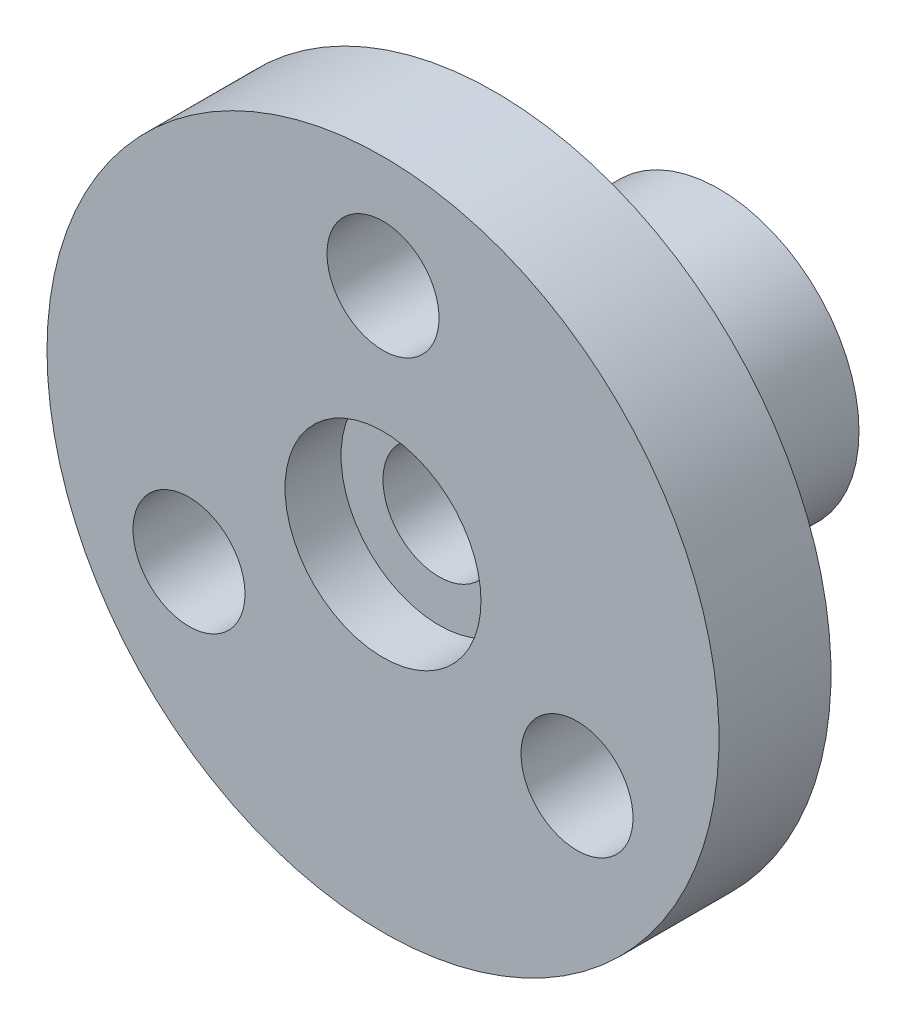
ISO-10303-21;
HEADER;
FILE_DESCRIPTION(('STEP AP214'),'2;1');
FILE_NAME('part.step','',(''),(''),'','','');
FILE_SCHEMA(('AUTOMOTIVE_DESIGN { 1 0 10303 214 1 1 1 1 }'));
ENDSEC;
DATA;
#1=APPLICATION_CONTEXT('core data for automotive mechanical design processes');
#2=APPLICATION_PROTOCOL_DEFINITION('international standard','automotive_design',2000,#1);
#3=PRODUCT_CONTEXT('',#1,'mechanical');
#4=PRODUCT('Part','Part','',(#3));
#5=PRODUCT_RELATED_PRODUCT_CATEGORY('part','',(#4));
#6=PRODUCT_DEFINITION_FORMATION('','',#4);
#7=PRODUCT_DEFINITION_CONTEXT('part definition',#1,'design');
#8=PRODUCT_DEFINITION('design','',#6,#7);
#9=PRODUCT_DEFINITION_SHAPE('','',#8);
#10=(LENGTH_UNIT() NAMED_UNIT(*) SI_UNIT(.MILLI.,.METRE.));
#11=(NAMED_UNIT(*) PLANE_ANGLE_UNIT() SI_UNIT($,.RADIAN.));
#12=(NAMED_UNIT(*) SI_UNIT($,.STERADIAN.) SOLID_ANGLE_UNIT());
#13=UNCERTAINTY_MEASURE_WITH_UNIT(LENGTH_MEASURE(1.E-05),#10,'distance_accuracy_value','');
#14=(GEOMETRIC_REPRESENTATION_CONTEXT(3) GLOBAL_UNCERTAINTY_ASSIGNED_CONTEXT((#13)) GLOBAL_UNIT_ASSIGNED_CONTEXT((#10,
#11,#12)) REPRESENTATION_CONTEXT('',''));
#15=CARTESIAN_POINT('',(0.,0.,0.));
#16=DIRECTION('',(0.,0.,1.));
#17=DIRECTION('',(1.,0.,0.));
#18=AXIS2_PLACEMENT_3D('',#15,#16,#17);
#19=CARTESIAN_POINT('',(0.,0.,0.));
#20=DIRECTION('',(0.,0.,1.));
#21=DIRECTION('',(1.,0.,0.));
#22=AXIS2_PLACEMENT_3D('',#19,#20,#21);
#23=CYLINDRICAL_SURFACE('',#22,1.5875);
#24=CARTESIAN_POINT('',(0.,0.,7.9375));
#25=DIRECTION('',(0.,0.,1.));
#26=DIRECTION('',(1.,0.,0.));
#27=AXIS2_PLACEMENT_3D('',#24,#25,#26);
#28=CIRCLE('',#27,1.5875);
#29=CARTESIAN_POINT('',(1.5875,0.,7.9375));
#30=VERTEX_POINT('',#29);
#31=EDGE_CURVE('E33',#30,#30,#28,.F.);
#32=CARTESIAN_POINT('',(0.,0.,1.58750000000001));
#33=DIRECTION('',(0.,0.,-1.));
#34=DIRECTION('',(-1.,0.,0.));
#35=AXIS2_PLACEMENT_3D('',#32,#33,#34);
#36=CIRCLE('',#35,1.5875);
#37=CARTESIAN_POINT('',(1.5875,0.,1.58750000000001));
#38=VERTEX_POINT('',#37);
#39=EDGE_CURVE('E17',#38,#38,#36,.F.);
#40=CARTESIAN_POINT('',(1.5875,0.,7.9375));
#41=CARTESIAN_POINT('',(1.5875,0.,7.87135416666667));
#42=CARTESIAN_POINT('',(1.5875,0.,7.80520833333333));
#43=CARTESIAN_POINT('',(1.5875,0.,7.67291666666667));
#44=CARTESIAN_POINT('',(1.5875,0.,7.60677083333333));
#45=CARTESIAN_POINT('',(1.5875,0.,7.47447916666667));
#46=CARTESIAN_POINT('',(1.5875,0.,7.40833333333333));
#47=CARTESIAN_POINT('',(1.5875,0.,7.27604166666667));
#48=CARTESIAN_POINT('',(1.5875,0.,7.20989583333333));
#49=CARTESIAN_POINT('',(1.5875,0.,7.07760416666667));
#50=CARTESIAN_POINT('',(1.5875,0.,7.01145833333333));
#51=CARTESIAN_POINT('',(1.5875,0.,6.87916666666667));
#52=CARTESIAN_POINT('',(1.5875,0.,6.81302083333333));
#53=CARTESIAN_POINT('',(1.5875,0.,6.68072916666667));
#54=CARTESIAN_POINT('',(1.5875,0.,6.61458333333333));
#55=CARTESIAN_POINT('',(1.5875,0.,6.48229166666667));
#56=CARTESIAN_POINT('',(1.5875,0.,6.41614583333333));
#57=CARTESIAN_POINT('',(1.5875,0.,6.28385416666667));
#58=CARTESIAN_POINT('',(1.5875,0.,6.21770833333333));
#59=CARTESIAN_POINT('',(1.5875,0.,6.08541666666667));
#60=CARTESIAN_POINT('',(1.5875,0.,6.01927083333333));
#61=CARTESIAN_POINT('',(1.5875,0.,5.88697916666667));
#62=CARTESIAN_POINT('',(1.5875,0.,5.82083333333333));
#63=CARTESIAN_POINT('',(1.5875,0.,5.68854166666667));
#64=CARTESIAN_POINT('',(1.5875,0.,5.62239583333333));
#65=CARTESIAN_POINT('',(1.5875,0.,5.49010416666667));
#66=CARTESIAN_POINT('',(1.5875,0.,5.42395833333333));
#67=CARTESIAN_POINT('',(1.5875,0.,5.29166666666667));
#68=CARTESIAN_POINT('',(1.5875,0.,5.22552083333333));
#69=CARTESIAN_POINT('',(1.5875,0.,5.09322916666667));
#70=CARTESIAN_POINT('',(1.5875,0.,5.02708333333333));
#71=CARTESIAN_POINT('',(1.5875,0.,4.89479166666667));
#72=CARTESIAN_POINT('',(1.5875,0.,4.82864583333333));
#73=CARTESIAN_POINT('',(1.5875,0.,4.69635416666667));
#74=CARTESIAN_POINT('',(1.5875,0.,4.63020833333333));
#75=CARTESIAN_POINT('',(1.5875,0.,4.49791666666667));
#76=CARTESIAN_POINT('',(1.5875,0.,4.43177083333333));
#77=CARTESIAN_POINT('',(1.5875,0.,4.29947916666667));
#78=CARTESIAN_POINT('',(1.5875,0.,4.23333333333334));
#79=CARTESIAN_POINT('',(1.5875,0.,4.10104166666667));
#80=CARTESIAN_POINT('',(1.5875,0.,4.03489583333334));
#81=CARTESIAN_POINT('',(1.5875,0.,3.90260416666667));
#82=CARTESIAN_POINT('',(1.5875,0.,3.83645833333334));
#83=CARTESIAN_POINT('',(1.5875,0.,3.70416666666667));
#84=CARTESIAN_POINT('',(1.5875,0.,3.63802083333334));
#85=CARTESIAN_POINT('',(1.5875,0.,3.50572916666667));
#86=CARTESIAN_POINT('',(1.5875,0.,3.43958333333334));
#87=CARTESIAN_POINT('',(1.5875,0.,3.30729166666667));
#88=CARTESIAN_POINT('',(1.5875,0.,3.24114583333334));
#89=CARTESIAN_POINT('',(1.5875,0.,3.10885416666667));
#90=CARTESIAN_POINT('',(1.5875,0.,3.04270833333334));
#91=CARTESIAN_POINT('',(1.5875,0.,2.91041666666667));
#92=CARTESIAN_POINT('',(1.5875,0.,2.84427083333334));
#93=CARTESIAN_POINT('',(1.5875,0.,2.71197916666667));
#94=CARTESIAN_POINT('',(1.5875,0.,2.64583333333334));
#95=CARTESIAN_POINT('',(1.5875,0.,2.51354166666667));
#96=CARTESIAN_POINT('',(1.5875,0.,2.44739583333334));
#97=CARTESIAN_POINT('',(1.5875,0.,2.31510416666667));
#98=CARTESIAN_POINT('',(1.5875,0.,2.24895833333334));
#99=CARTESIAN_POINT('',(1.5875,0.,2.11666666666667));
#100=CARTESIAN_POINT('',(1.5875,0.,2.05052083333334));
#101=CARTESIAN_POINT('',(1.5875,0.,1.91822916666667));
#102=CARTESIAN_POINT('',(1.5875,0.,1.85208333333334));
#103=CARTESIAN_POINT('',(1.5875,0.,1.71979166666667));
#104=CARTESIAN_POINT('',(1.5875,0.,1.65364583333334));
#105=CARTESIAN_POINT('',(1.5875,0.,1.58750000000001));
#106=B_SPLINE_CURVE_WITH_KNOTS('',3,(#40,#41,#42,#43,#44,#45,#46,#47,#48,#49,#50,#51,#52,#53,
#54,#55,#56,#57,#58,#59,#60,#61,#62,#63,#64,#65,#66,#67,#68,#69,#70,#71,#72,#73,#74,#75,#76,#77,
#78,#79,#80,#81,#82,#83,#84,#85,#86,#87,#88,#89,#90,#91,#92,#93,#94,#95,#96,#97,#98,#99,#100,
#101,#102,#103,#104,#105),.UNSPECIFIED.,.F.,.F.,(4,2,2,2,2,2,2,2,2,2,2,2,2,2,2,2,2,2,2,2,2,2,2,
2,2,2,2,2,2,2,2,2,4),(0.,0.198437499999999,0.396874999999999,0.595312499999999,
0.793749999999998,0.992187499999998,1.190625,1.3890625,1.5875,1.7859375,1.984375,2.1828125,
2.38125,2.5796875,2.778125,2.9765625,3.175,3.3734375,3.571875,3.7703125,3.96875,4.1671875,
4.365625,4.5640625,4.76249999999999,4.96093749999999,5.15937499999999,5.35781249999999,
5.55624999999999,5.75468749999999,5.95312499999999,6.15156249999999,6.34999999999999),.UNSPECIFIED.);
#107=EDGE_CURVE('BSEAM13',#30,#38,#106,.T.);
#108=ORIENTED_EDGE('',*,*,#31,.F.);
#109=ORIENTED_EDGE('',*,*,#39,.F.);
#110=ORIENTED_EDGE('',*,*,#107,.T.);
#111=ORIENTED_EDGE('',*,*,#107,.F.);
#112=EDGE_LOOP('',(#108,#110,#109,#111));
#113=FACE_BOUND('',#112,.T.);
#114=ADVANCED_FACE('F13',(#113),#23,.F.);
#115=CARTESIAN_POINT('',(0.,0.,9.52500000000001));
#116=DIRECTION('',(0.,0.,-1.));
#117=DIRECTION('',(-1.,0.,0.));
#118=AXIS2_PLACEMENT_3D('',#115,#116,#117);
#119=CYLINDRICAL_SURFACE('',#118,9.525);
#120=CARTESIAN_POINT('',(0.,0.,6.35000000000001));
#121=DIRECTION('',(0.,0.,1.));
#122=DIRECTION('',(1.,0.,0.));
#123=AXIS2_PLACEMENT_3D('',#120,#121,#122);
#124=CIRCLE('',#123,9.525);
#125=CARTESIAN_POINT('',(-9.525,0.,6.35000000000001));
#126=VERTEX_POINT('',#125);
#127=EDGE_CURVE('E21',#126,#126,#124,.T.);
#128=CARTESIAN_POINT('',(0.,0.,9.52500000000001));
#129=DIRECTION('',(0.,0.,1.));
#130=DIRECTION('',(1.,0.,0.));
#131=AXIS2_PLACEMENT_3D('',#128,#129,#130);
#132=CIRCLE('',#131,9.525);
#133=CARTESIAN_POINT('',(-9.525,0.,9.52500000000001));
#134=VERTEX_POINT('',#133);
#135=EDGE_CURVE('E9',#134,#134,#132,.T.);
#136=CARTESIAN_POINT('',(-9.525,0.,6.35000000000001));
#137=CARTESIAN_POINT('',(-9.525,0.,6.38307291666668));
#138=CARTESIAN_POINT('',(-9.525,0.,6.41614583333334));
#139=CARTESIAN_POINT('',(-9.525,0.,6.48229166666667));
#140=CARTESIAN_POINT('',(-9.525,0.,6.51536458333334));
#141=CARTESIAN_POINT('',(-9.525,0.,6.58151041666667));
#142=CARTESIAN_POINT('',(-9.525,0.,6.61458333333334));
#143=CARTESIAN_POINT('',(-9.525,0.,6.68072916666667));
#144=CARTESIAN_POINT('',(-9.525,0.,6.71380208333334));
#145=CARTESIAN_POINT('',(-9.525,0.,6.77994791666667));
#146=CARTESIAN_POINT('',(-9.525,0.,6.81302083333334));
#147=CARTESIAN_POINT('',(-9.525,0.,6.87916666666667));
#148=CARTESIAN_POINT('',(-9.525,0.,6.91223958333334));
#149=CARTESIAN_POINT('',(-9.525,0.,6.97838541666667));
#150=CARTESIAN_POINT('',(-9.525,0.,7.01145833333334));
#151=CARTESIAN_POINT('',(-9.525,0.,7.07760416666667));
#152=CARTESIAN_POINT('',(-9.525,0.,7.11067708333334));
#153=CARTESIAN_POINT('',(-9.525,0.,7.17682291666667));
#154=CARTESIAN_POINT('',(-9.525,0.,7.20989583333334));
#155=CARTESIAN_POINT('',(-9.525,0.,7.27604166666667));
#156=CARTESIAN_POINT('',(-9.525,0.,7.30911458333334));
#157=CARTESIAN_POINT('',(-9.525,0.,7.37526041666667));
#158=CARTESIAN_POINT('',(-9.525,0.,7.40833333333334));
#159=CARTESIAN_POINT('',(-9.525,0.,7.47447916666667));
#160=CARTESIAN_POINT('',(-9.525,0.,7.50755208333334));
#161=CARTESIAN_POINT('',(-9.525,0.,7.57369791666667));
#162=CARTESIAN_POINT('',(-9.525,0.,7.60677083333334));
#163=CARTESIAN_POINT('',(-9.525,0.,7.67291666666667));
#164=CARTESIAN_POINT('',(-9.525,0.,7.70598958333334));
#165=CARTESIAN_POINT('',(-9.525,0.,7.77213541666667));
#166=CARTESIAN_POINT('',(-9.525,0.,7.80520833333334));
#167=CARTESIAN_POINT('',(-9.525,0.,7.87135416666667));
#168=CARTESIAN_POINT('',(-9.525,0.,7.90442708333334));
#169=CARTESIAN_POINT('',(-9.525,0.,7.97057291666667));
#170=CARTESIAN_POINT('',(-9.525,0.,8.00364583333334));
#171=CARTESIAN_POINT('',(-9.525,0.,8.06979166666667));
#172=CARTESIAN_POINT('',(-9.525,0.,8.10286458333334));
#173=CARTESIAN_POINT('',(-9.525,0.,8.16901041666667));
#174=CARTESIAN_POINT('',(-9.525,0.,8.20208333333334));
#175=CARTESIAN_POINT('',(-9.525,0.,8.26822916666667));
#176=CARTESIAN_POINT('',(-9.525,0.,8.30130208333334));
#177=CARTESIAN_POINT('',(-9.525,0.,8.36744791666667));
#178=CARTESIAN_POINT('',(-9.525,0.,8.40052083333334));
#179=CARTESIAN_POINT('',(-9.525,0.,8.46666666666667));
#180=CARTESIAN_POINT('',(-9.525,0.,8.49973958333334));
#181=CARTESIAN_POINT('',(-9.525,0.,8.56588541666667));
#182=CARTESIAN_POINT('',(-9.525,0.,8.59895833333334));
#183=CARTESIAN_POINT('',(-9.525,0.,8.66510416666667));
#184=CARTESIAN_POINT('',(-9.525,0.,8.69817708333334));
#185=CARTESIAN_POINT('',(-9.525,0.,8.76432291666667));
#186=CARTESIAN_POINT('',(-9.525,0.,8.79739583333334));
#187=CARTESIAN_POINT('',(-9.525,0.,8.86354166666667));
#188=CARTESIAN_POINT('',(-9.525,0.,8.89661458333334));
#189=CARTESIAN_POINT('',(-9.525,0.,8.96276041666667));
#190=CARTESIAN_POINT('',(-9.525,0.,8.99583333333334));
#191=CARTESIAN_POINT('',(-9.525,0.,9.06197916666667));
#192=CARTESIAN_POINT('',(-9.525,0.,9.09505208333334));
#193=CARTESIAN_POINT('',(-9.525,0.,9.16119791666667));
#194=CARTESIAN_POINT('',(-9.525,0.,9.19427083333334));
#195=CARTESIAN_POINT('',(-9.525,0.,9.26041666666667));
#196=CARTESIAN_POINT('',(-9.525,0.,9.29348958333334));
#197=CARTESIAN_POINT('',(-9.525,0.,9.35963541666667));
#198=CARTESIAN_POINT('',(-9.525,0.,9.39270833333334));
#199=CARTESIAN_POINT('',(-9.525,0.,9.45885416666667));
#200=CARTESIAN_POINT('',(-9.525,0.,9.49192708333334));
#201=CARTESIAN_POINT('',(-9.525,0.,9.52500000000001));
#202=B_SPLINE_CURVE_WITH_KNOTS('',3,(#136,#137,#138,#139,#140,#141,#142,#143,#144,#145,#146,
#147,#148,#149,#150,#151,#152,#153,#154,#155,#156,#157,#158,#159,#160,#161,#162,#163,#164,#165,
#166,#167,#168,#169,#170,#171,#172,#173,#174,#175,#176,#177,#178,#179,#180,#181,#182,#183,#184,
#185,#186,#187,#188,#189,#190,#191,#192,#193,#194,#195,#196,#197,#198,#199,#200,#201),
.UNSPECIFIED.,.F.,.F.,(4,2,2,2,2,2,2,2,2,2,2,2,2,2,2,2,2,2,2,2,2,2,2,2,2,2,2,2,2,2,2,2,4),(0.,
0.0992187499999995,0.198437499999999,0.297656249999999,0.396875,0.496093749999999,
0.595312499999999,0.694531249999999,0.793749999999999,0.892968749999999,0.992187499999998,
1.09140625,1.190625,1.28984375,1.3890625,1.48828125,1.5875,1.68671875,1.7859375,1.88515625,
1.984375,2.08359375,2.1828125,2.28203125,2.38125,2.48046875,2.5796875,2.67890625,2.778125,
2.87734375,2.9765625,3.07578125,3.175),.UNSPECIFIED.);
#203=EDGE_CURVE('BSEAM15',#126,#134,#202,.T.);
#204=ORIENTED_EDGE('',*,*,#127,.T.);
#205=ORIENTED_EDGE('',*,*,#135,.F.);
#206=ORIENTED_EDGE('',*,*,#203,.T.);
#207=ORIENTED_EDGE('',*,*,#203,.F.);
#208=EDGE_LOOP('',(#204,#206,#205,#207));
#209=FACE_BOUND('',#208,.T.);
#210=ADVANCED_FACE('F15',(#209),#119,.T.);
#211=CARTESIAN_POINT('',(0.,0.,9.52500000000001));
#212=DIRECTION('',(0.,0.,1.));
#213=DIRECTION('',(1.,0.,0.));
#214=AXIS2_PLACEMENT_3D('',#211,#212,#213);
#215=PLANE('',#214);
#216=CARTESIAN_POINT('',(-5.49926131403122,-3.17499999999995,9.52500000000001));
#217=DIRECTION('',(0.,0.,-1.));
#218=DIRECTION('',(1.,0.,0.));
#219=AXIS2_PLACEMENT_3D('',#216,#217,#218);
#220=CIRCLE('',#219,1.5875);
#221=CARTESIAN_POINT('',(-3.91176131403122,-3.17499999999995,9.52500000000001));
#222=VERTEX_POINT('',#221);
#223=EDGE_CURVE('E64',#222,#222,#220,.T.);
#224=ORIENTED_EDGE('',*,*,#223,.T.);
#225=EDGE_LOOP('',(#224));
#226=FACE_BOUND('',#225,.T.);
#227=CARTESIAN_POINT('',(5.49926131403121,-3.17499999999995,9.52500000000001));
#228=DIRECTION('',(0.,0.,-1.));
#229=DIRECTION('',(-1.,0.,0.));
#230=AXIS2_PLACEMENT_3D('',#227,#228,#229);
#231=CIRCLE('',#230,1.5875);
#232=CARTESIAN_POINT('',(3.91176131403122,-3.17499999999995,9.52500000000001));
#233=VERTEX_POINT('',#232);
#234=EDGE_CURVE('E58',#233,#233,#231,.T.);
#235=ORIENTED_EDGE('',*,*,#234,.T.);
#236=EDGE_LOOP('',(#235));
#237=FACE_BOUND('',#236,.T.);
#238=CARTESIAN_POINT('',(0.,6.35,9.52500000000001));
#239=DIRECTION('',(0.,0.,-1.));
#240=DIRECTION('',(-1.,0.,0.));
#241=AXIS2_PLACEMENT_3D('',#238,#239,#240);
#242=CIRCLE('',#241,1.5875);
#243=CARTESIAN_POINT('',(-1.5875,6.35,9.52500000000001));
#244=VERTEX_POINT('',#243);
#245=EDGE_CURVE('E52',#244,#244,#242,.T.);
#246=ORIENTED_EDGE('',*,*,#245,.T.);
#247=EDGE_LOOP('',(#246));
#248=FACE_BOUND('',#247,.T.);
#249=CARTESIAN_POINT('',(0.,0.,9.52500000000001));
#250=DIRECTION('',(0.,0.,1.));
#251=DIRECTION('',(1.,0.,0.));
#252=AXIS2_PLACEMENT_3D('',#249,#250,#251);
#253=CIRCLE('',#252,2.77749);
#254=CARTESIAN_POINT('',(2.77749,0.,9.52500000000001));
#255=VERTEX_POINT('',#254);
#256=EDGE_CURVE('E40',#255,#255,#253,.T.);
#257=ORIENTED_EDGE('',*,*,#256,.F.);
#258=EDGE_LOOP('',(#257));
#259=FACE_BOUND('',#258,.T.);
#260=ORIENTED_EDGE('',*,*,#135,.T.);
#261=EDGE_LOOP('',(#260));
#262=FACE_BOUND('',#261,.T.);
#263=ADVANCED_FACE('F77',(#226,#237,#248,#259,#262),#215,.T.);
#264=CARTESIAN_POINT('',(0.,0.,6.34999999999999));
#265=DIRECTION('',(0.,0.,1.));
#266=DIRECTION('',(1.,0.,0.));
#267=AXIS2_PLACEMENT_3D('',#264,#265,#266);
#268=PLANE('',#267);
#269=CARTESIAN_POINT('',(-5.49926131403122,-3.17499999999995,6.34999999999999));
#270=DIRECTION('',(0.,0.,-1.));
#271=DIRECTION('',(1.,0.,0.));
#272=AXIS2_PLACEMENT_3D('',#269,#270,#271);
#273=CIRCLE('',#272,1.5875);
#274=CARTESIAN_POINT('',(-3.91176131403122,-3.17499999999995,6.34999999999999));
#275=VERTEX_POINT('',#274);
#276=EDGE_CURVE('E67',#275,#275,#273,.T.);
#277=ORIENTED_EDGE('',*,*,#276,.F.);
#278=EDGE_LOOP('',(#277));
#279=FACE_BOUND('',#278,.T.);
#280=CARTESIAN_POINT('',(5.49926131403121,-3.17499999999995,6.34999999999999));
#281=DIRECTION('',(0.,0.,-1.));
#282=DIRECTION('',(-1.,0.,0.));
#283=AXIS2_PLACEMENT_3D('',#280,#281,#282);
#284=CIRCLE('',#283,1.5875);
#285=CARTESIAN_POINT('',(3.91176131403122,-3.17499999999995,6.34999999999999));
#286=VERTEX_POINT('',#285);
#287=EDGE_CURVE('E61',#286,#286,#284,.T.);
#288=ORIENTED_EDGE('',*,*,#287,.F.);
#289=EDGE_LOOP('',(#288));
#290=FACE_BOUND('',#289,.T.);
#291=CARTESIAN_POINT('',(0.,6.35,6.34999999999999));
#292=DIRECTION('',(0.,0.,-1.));
#293=DIRECTION('',(-1.,0.,0.));
#294=AXIS2_PLACEMENT_3D('',#291,#292,#293);
#295=CIRCLE('',#294,1.5875);
#296=CARTESIAN_POINT('',(-1.5875,6.35,6.34999999999999));
#297=VERTEX_POINT('',#296);
#298=EDGE_CURVE('E55',#297,#297,#295,.T.);
#299=ORIENTED_EDGE('',*,*,#298,.F.);
#300=EDGE_LOOP('',(#299));
#301=FACE_BOUND('',#300,.T.);
#302=CARTESIAN_POINT('',(0.,0.,6.34999999999999));
#303=DIRECTION('',(0.,0.,1.));
#304=DIRECTION('',(1.,0.,0.));
#305=AXIS2_PLACEMENT_3D('',#302,#303,#304);
#306=CIRCLE('',#305,3.96875);
#307=CARTESIAN_POINT('',(3.96875,0.,6.34999999999999));
#308=VERTEX_POINT('',#307);
#309=EDGE_CURVE('E30',#308,#308,#306,.T.);
#310=ORIENTED_EDGE('',*,*,#309,.T.);
#311=EDGE_LOOP('',(#310));
#312=FACE_BOUND('',#311,.T.);
#313=ORIENTED_EDGE('',*,*,#127,.F.);
#314=EDGE_LOOP('',(#313));
#315=FACE_BOUND('',#314,.T.);
#316=ADVANCED_FACE('F73',(#279,#290,#301,#312,#315),#268,.F.);
#317=CARTESIAN_POINT('',(0.,0.,-31.75));
#318=DIRECTION('',(0.,0.,1.));
#319=DIRECTION('',(1.,0.,0.));
#320=AXIS2_PLACEMENT_3D('',#317,#318,#319);
#321=CYLINDRICAL_SURFACE('',#320,3.96875);
#322=CARTESIAN_POINT('',(0.,0.,0.));
#323=DIRECTION('',(0.,0.,1.));
#324=DIRECTION('',(1.,0.,0.));
#325=AXIS2_PLACEMENT_3D('',#322,#323,#324);
#326=CIRCLE('',#325,3.96875);
#327=CARTESIAN_POINT('',(3.96875,0.,0.));
#328=VERTEX_POINT('',#327);
#329=EDGE_CURVE('E26',#328,#328,#326,.T.);
#330=CARTESIAN_POINT('',(3.96875,0.,6.34999999999999));
#331=CARTESIAN_POINT('',(3.96875,0.,6.28385416666665));
#332=CARTESIAN_POINT('',(3.96875,0.,6.21770833333332));
#333=CARTESIAN_POINT('',(3.96875,0.,6.08541666666665));
#334=CARTESIAN_POINT('',(3.96875,0.,6.01927083333332));
#335=CARTESIAN_POINT('',(3.96875,0.,5.88697916666666));
#336=CARTESIAN_POINT('',(3.96875,0.,5.82083333333332));
#337=CARTESIAN_POINT('',(3.96875,0.,5.68854166666666));
#338=CARTESIAN_POINT('',(3.96875,0.,5.62239583333332));
#339=CARTESIAN_POINT('',(3.96875,0.,5.49010416666666));
#340=CARTESIAN_POINT('',(3.96875,0.,5.42395833333332));
#341=CARTESIAN_POINT('',(3.96875,0.,5.29166666666666));
#342=CARTESIAN_POINT('',(3.96875,0.,5.22552083333332));
#343=CARTESIAN_POINT('',(3.96875,0.,5.09322916666665));
#344=CARTESIAN_POINT('',(3.96875,0.,5.02708333333332));
#345=CARTESIAN_POINT('',(3.96875,0.,4.89479166666666));
#346=CARTESIAN_POINT('',(3.96875,0.,4.82864583333332));
#347=CARTESIAN_POINT('',(3.96875,0.,4.69635416666666));
#348=CARTESIAN_POINT('',(3.96875,0.,4.63020833333332));
#349=CARTESIAN_POINT('',(3.96875,0.,4.49791666666665));
#350=CARTESIAN_POINT('',(3.96875,0.,4.43177083333332));
#351=CARTESIAN_POINT('',(3.96875,0.,4.29947916666666));
#352=CARTESIAN_POINT('',(3.96875,0.,4.23333333333332));
#353=CARTESIAN_POINT('',(3.96875,0.,4.10104166666665));
#354=CARTESIAN_POINT('',(3.96875,0.,4.03489583333332));
#355=CARTESIAN_POINT('',(3.96875,0.,3.90260416666665));
#356=CARTESIAN_POINT('',(3.96875,0.,3.83645833333332));
#357=CARTESIAN_POINT('',(3.96875,0.,3.70416666666666));
#358=CARTESIAN_POINT('',(3.96875,0.,3.63802083333332));
#359=CARTESIAN_POINT('',(3.96875,0.,3.50572916666666));
#360=CARTESIAN_POINT('',(3.96875,0.,3.43958333333332));
#361=CARTESIAN_POINT('',(3.96875,0.,3.30729166666666));
#362=CARTESIAN_POINT('',(3.96875,0.,3.24114583333332));
#363=CARTESIAN_POINT('',(3.96875,0.,3.10885416666666));
#364=CARTESIAN_POINT('',(3.96875,0.,3.04270833333332));
#365=CARTESIAN_POINT('',(3.96875,0.,2.91041666666666));
#366=CARTESIAN_POINT('',(3.96875,0.,2.84427083333332));
#367=CARTESIAN_POINT('',(3.96875,0.,2.71197916666666));
#368=CARTESIAN_POINT('',(3.96875,0.,2.64583333333332));
#369=CARTESIAN_POINT('',(3.96875,0.,2.51354166666666));
#370=CARTESIAN_POINT('',(3.96875,0.,2.44739583333333));
#371=CARTESIAN_POINT('',(3.96875,0.,2.31510416666666));
#372=CARTESIAN_POINT('',(3.96875,0.,2.24895833333333));
#373=CARTESIAN_POINT('',(3.96875,0.,2.11666666666666));
#374=CARTESIAN_POINT('',(3.96875,0.,2.05052083333332));
#375=CARTESIAN_POINT('',(3.96875,0.,1.91822916666666));
#376=CARTESIAN_POINT('',(3.96875,0.,1.85208333333333));
#377=CARTESIAN_POINT('',(3.96875,0.,1.71979166666666));
#378=CARTESIAN_POINT('',(3.96875,0.,1.65364583333333));
#379=CARTESIAN_POINT('',(3.96875,0.,1.52135416666666));
#380=CARTESIAN_POINT('',(3.96875,0.,1.45520833333332));
#381=CARTESIAN_POINT('',(3.96875,0.,1.32291666666666));
#382=CARTESIAN_POINT('',(3.96875,0.,1.25677083333333));
#383=CARTESIAN_POINT('',(3.96875,0.,1.12447916666666));
#384=CARTESIAN_POINT('',(3.96875,0.,1.05833333333333));
#385=CARTESIAN_POINT('',(3.96875,0.,0.926041666666657));
#386=CARTESIAN_POINT('',(3.96875,0.,0.859895833333323));
#387=CARTESIAN_POINT('',(3.96875,0.,0.727604166666657));
#388=CARTESIAN_POINT('',(3.96875,0.,0.661458333333325));
#389=CARTESIAN_POINT('',(3.96875,0.,0.529166666666659));
#390=CARTESIAN_POINT('',(3.96875,0.,0.463020833333325));
#391=CARTESIAN_POINT('',(3.96875,0.,0.330729166666659));
#392=CARTESIAN_POINT('',(3.96875,0.,0.264583333333327));
#393=CARTESIAN_POINT('',(3.96875,0.,0.132291666666661));
#394=CARTESIAN_POINT('',(3.96875,0.,0.0661458333333273));
#395=CARTESIAN_POINT('',(3.96875,0.,0.));
#396=B_SPLINE_CURVE_WITH_KNOTS('',3,(#330,#331,#332,#333,#334,#335,#336,#337,#338,#339,#340,
#341,#342,#343,#344,#345,#346,#347,#348,#349,#350,#351,#352,#353,#354,#355,#356,#357,#358,#359,
#360,#361,#362,#363,#364,#365,#366,#367,#368,#369,#370,#371,#372,#373,#374,#375,#376,#377,#378,
#379,#380,#381,#382,#383,#384,#385,#386,#387,#388,#389,#390,#391,#392,#393,#394,#395),
.UNSPECIFIED.,.F.,.F.,(4,2,2,2,2,2,2,2,2,2,2,2,2,2,2,2,2,2,2,2,2,2,2,2,2,2,2,2,2,2,2,2,4),(0.,
0.198437500000002,0.396874999999998,0.5953125,0.793749999999996,0.992187499999998,1.190625,
1.3890625,1.5875,1.7859375,1.984375,2.1828125,2.38125,2.5796875,2.778125,2.97656249999999,3.175,
3.3734375,3.571875,3.7703125,3.96874999999999,4.1671875,4.365625,4.56406249999999,4.7625,
4.9609375,5.15937499999999,5.3578125,5.55625,5.75468749999999,5.953125,6.15156249999999,
6.34999999999999),.UNSPECIFIED.);
#397=EDGE_CURVE('BSEAM76',#308,#328,#396,.T.);
#398=ORIENTED_EDGE('',*,*,#309,.F.);
#399=ORIENTED_EDGE('',*,*,#329,.T.);
#400=ORIENTED_EDGE('',*,*,#397,.T.);
#401=ORIENTED_EDGE('',*,*,#397,.F.);
#402=EDGE_LOOP('',(#398,#400,#399,#401));
#403=FACE_BOUND('',#402,.T.);
#404=ADVANCED_FACE('F76',(#403),#321,.T.);
#405=CARTESIAN_POINT('',(0.,0.,0.));
#406=DIRECTION('',(0.,0.,1.));
#407=DIRECTION('',(1.,0.,0.));
#408=AXIS2_PLACEMENT_3D('',#405,#406,#407);
#409=PLANE('',#408);
#410=CARTESIAN_POINT('',(0.,0.,0.));
#411=DIRECTION('',(0.,0.,-1.));
#412=DIRECTION('',(-1.,0.,0.));
#413=AXIS2_PLACEMENT_3D('',#410,#411,#412);
#414=CIRCLE('',#413,2.77749);
#415=CARTESIAN_POINT('',(-2.77749,0.,0.));
#416=VERTEX_POINT('',#415);
#417=EDGE_CURVE('E49',#416,#416,#414,.T.);
#418=ORIENTED_EDGE('',*,*,#417,.F.);
#419=EDGE_LOOP('',(#418));
#420=FACE_BOUND('',#419,.T.);
#421=ORIENTED_EDGE('',*,*,#329,.F.);
#422=EDGE_LOOP('',(#421));
#423=FACE_BOUND('',#422,.T.);
#424=ADVANCED_FACE('F105',(#420,#423),#409,.F.);
#425=CARTESIAN_POINT('',(0.,0.,7.9375));
#426=DIRECTION('',(0.,0.,1.));
#427=DIRECTION('',(1.,0.,0.));
#428=AXIS2_PLACEMENT_3D('',#425,#426,#427);
#429=PLANE('',#428);
#430=CARTESIAN_POINT('',(0.,0.,7.9375));
#431=DIRECTION('',(0.,0.,1.));
#432=DIRECTION('',(1.,0.,0.));
#433=AXIS2_PLACEMENT_3D('',#430,#431,#432);
#434=CIRCLE('',#433,2.77749);
#435=CARTESIAN_POINT('',(2.77749,0.,7.9375));
#436=VERTEX_POINT('',#435);
#437=EDGE_CURVE('E35',#436,#436,#434,.T.);
#438=ORIENTED_EDGE('',*,*,#437,.T.);
#439=EDGE_LOOP('',(#438));
#440=FACE_BOUND('',#439,.T.);
#441=ORIENTED_EDGE('',*,*,#31,.T.);
#442=EDGE_LOOP('',(#441));
#443=FACE_BOUND('',#442,.T.);
#444=ADVANCED_FACE('F109',(#440,#443),#429,.T.);
#445=CARTESIAN_POINT('',(0.,0.,7.9375));
#446=DIRECTION('',(0.,0.,1.));
#447=DIRECTION('',(1.,0.,0.));
#448=AXIS2_PLACEMENT_3D('',#445,#446,#447);
#449=CYLINDRICAL_SURFACE('',#448,2.77749);
#450=ORIENTED_EDGE('',*,*,#437,.F.);
#451=EDGE_LOOP('',(#450));
#452=FACE_BOUND('',#451,.T.);
#453=ORIENTED_EDGE('',*,*,#256,.T.);
#454=EDGE_LOOP('',(#453));
#455=FACE_BOUND('',#454,.T.);
#456=ADVANCED_FACE('F102',(#452,#455),#449,.F.);
#457=CARTESIAN_POINT('',(0.,0.,1.58750000000001));
#458=DIRECTION('',(0.,0.,-1.));
#459=DIRECTION('',(-1.,0.,0.));
#460=AXIS2_PLACEMENT_3D('',#457,#458,#459);
#461=PLANE('',#460);
#462=CARTESIAN_POINT('',(0.,0.,1.58750000000001));
#463=DIRECTION('',(0.,0.,-1.));
#464=DIRECTION('',(-1.,0.,0.));
#465=AXIS2_PLACEMENT_3D('',#462,#463,#464);
#466=CIRCLE('',#465,2.77749);
#467=CARTESIAN_POINT('',(-2.77749,0.,1.58750000000001));
#468=VERTEX_POINT('',#467);
#469=EDGE_CURVE('E46',#468,#468,#466,.T.);
#470=ORIENTED_EDGE('',*,*,#469,.T.);
#471=EDGE_LOOP('',(#470));
#472=FACE_BOUND('',#471,.T.);
#473=ORIENTED_EDGE('',*,*,#39,.T.);
#474=EDGE_LOOP('',(#473));
#475=FACE_BOUND('',#474,.T.);
#476=ADVANCED_FACE('F122',(#472,#475),#461,.T.);
#477=CARTESIAN_POINT('',(0.,0.,1.58750000000001));
#478=DIRECTION('',(0.,0.,-1.));
#479=DIRECTION('',(-1.,0.,0.));
#480=AXIS2_PLACEMENT_3D('',#477,#478,#479);
#481=CYLINDRICAL_SURFACE('',#480,2.77749);
#482=ORIENTED_EDGE('',*,*,#469,.F.);
#483=EDGE_LOOP('',(#482));
#484=FACE_BOUND('',#483,.T.);
#485=ORIENTED_EDGE('',*,*,#417,.T.);
#486=EDGE_LOOP('',(#485));
#487=FACE_BOUND('',#486,.T.);
#488=ADVANCED_FACE('F119',(#484,#487),#481,.F.);
#489=CARTESIAN_POINT('',(0.,6.35,9.52500000000001));
#490=DIRECTION('',(0.,0.,-1.));
#491=DIRECTION('',(-1.,0.,0.));
#492=AXIS2_PLACEMENT_3D('',#489,#490,#491);
#493=CYLINDRICAL_SURFACE('',#492,1.5875);
#494=ORIENTED_EDGE('',*,*,#245,.F.);
#495=EDGE_LOOP('',(#494));
#496=FACE_BOUND('',#495,.T.);
#497=ORIENTED_EDGE('',*,*,#298,.T.);
#498=EDGE_LOOP('',(#497));
#499=FACE_BOUND('',#498,.T.);
#500=ADVANCED_FACE('F121',(#496,#499),#493,.F.);
#501=CARTESIAN_POINT('',(5.49926131403121,-3.17499999999995,9.52500000000001));
#502=DIRECTION('',(0.,0.,-1.));
#503=DIRECTION('',(-1.,0.,0.));
#504=AXIS2_PLACEMENT_3D('',#501,#502,#503);
#505=CYLINDRICAL_SURFACE('',#504,1.5875);
#506=ORIENTED_EDGE('',*,*,#234,.F.);
#507=EDGE_LOOP('',(#506));
#508=FACE_BOUND('',#507,.T.);
#509=ORIENTED_EDGE('',*,*,#287,.T.);
#510=EDGE_LOOP('',(#509));
#511=FACE_BOUND('',#510,.T.);
#512=ADVANCED_FACE('F129',(#508,#511),#505,.F.);
#513=CARTESIAN_POINT('',(-5.49926131403122,-3.17499999999995,9.52500000000001));
#514=DIRECTION('',(0.,0.,-1.));
#515=DIRECTION('',(-1.,0.,0.));
#516=AXIS2_PLACEMENT_3D('',#513,#514,#515);
#517=CYLINDRICAL_SURFACE('',#516,1.5875);
#518=ORIENTED_EDGE('',*,*,#223,.F.);
#519=EDGE_LOOP('',(#518));
#520=FACE_BOUND('',#519,.T.);
#521=ORIENTED_EDGE('',*,*,#276,.T.);
#522=EDGE_LOOP('',(#521));
#523=FACE_BOUND('',#522,.T.);
#524=ADVANCED_FACE('F71',(#520,#523),#517,.F.);
#525=CLOSED_SHELL('',(#114,#210,#263,#316,#404,#424,#444,#456,#476,#488,#500,#512,#524));
#526=MANIFOLD_SOLID_BREP('B1',#525);
#527=ADVANCED_BREP_SHAPE_REPRESENTATION('',(#18,#526),#14);
#528=SHAPE_DEFINITION_REPRESENTATION(#9,#527);
ENDSEC;
END-ISO-10303-21;
